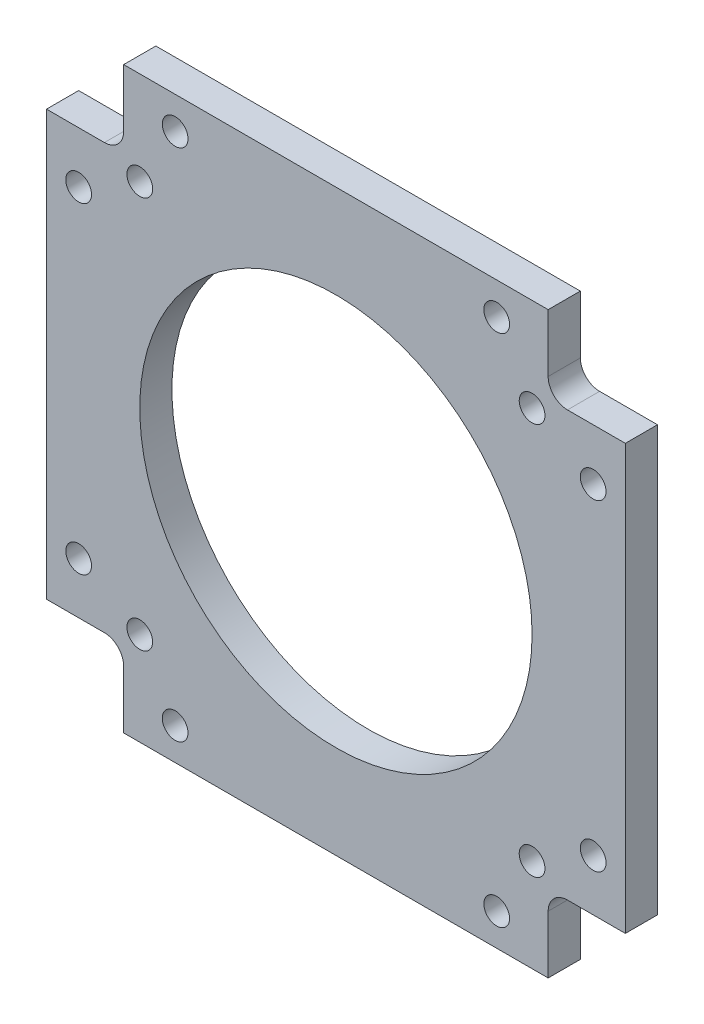
ISO-10303-21;
HEADER;
FILE_DESCRIPTION(('STEP AP214'),'2;1');
FILE_NAME('part.step','',(''),(''),'','','');
FILE_SCHEMA(('AUTOMOTIVE_DESIGN { 1 0 10303 214 1 1 1 1 }'));
ENDSEC;
DATA;
#1=APPLICATION_CONTEXT('core data for automotive mechanical design processes');
#2=APPLICATION_PROTOCOL_DEFINITION('international standard','automotive_design',2000,#1);
#3=PRODUCT_CONTEXT('',#1,'mechanical');
#4=PRODUCT('Part','Part','',(#3));
#5=PRODUCT_RELATED_PRODUCT_CATEGORY('part','',(#4));
#6=PRODUCT_DEFINITION_FORMATION('','',#4);
#7=PRODUCT_DEFINITION_CONTEXT('part definition',#1,'design');
#8=PRODUCT_DEFINITION('design','',#6,#7);
#9=PRODUCT_DEFINITION_SHAPE('','',#8);
#10=(LENGTH_UNIT() NAMED_UNIT(*) SI_UNIT(.MILLI.,.METRE.));
#11=(NAMED_UNIT(*) PLANE_ANGLE_UNIT() SI_UNIT($,.RADIAN.));
#12=(NAMED_UNIT(*) SI_UNIT($,.STERADIAN.) SOLID_ANGLE_UNIT());
#13=UNCERTAINTY_MEASURE_WITH_UNIT(LENGTH_MEASURE(1.E-05),#10,'distance_accuracy_value','');
#14=(GEOMETRIC_REPRESENTATION_CONTEXT(3) GLOBAL_UNCERTAINTY_ASSIGNED_CONTEXT((#13)) GLOBAL_UNIT_ASSIGNED_CONTEXT((#10,
#11,#12)) REPRESENTATION_CONTEXT('',''));
#15=CARTESIAN_POINT('',(0.,0.,0.));
#16=DIRECTION('',(0.,0.,1.));
#17=DIRECTION('',(1.,0.,0.));
#18=AXIS2_PLACEMENT_3D('',#15,#16,#17);
#19=CARTESIAN_POINT('',(0.,0.,5.));
#20=DIRECTION('',(0.,0.,-1.));
#21=DIRECTION('',(-1.,0.,0.));
#22=AXIS2_PLACEMENT_3D('',#19,#20,#21);
#23=PLANE('',#22);
#24=CARTESIAN_POINT('',(-40.,25.,5.));
#25=DIRECTION('',(0.,0.,-1.));
#26=DIRECTION('',(-1.,0.,0.));
#27=AXIS2_PLACEMENT_3D('',#24,#25,#26);
#28=CIRCLE('',#27,2.);
#29=CARTESIAN_POINT('',(-42.,25.,5.));
#30=VERTEX_POINT('',#29);
#31=EDGE_CURVE('E406',#30,#30,#28,.F.);
#32=ORIENTED_EDGE('',*,*,#31,.F.);
#33=EDGE_LOOP('',(#32));
#34=FACE_BOUND('',#33,.T.);
#35=CARTESIAN_POINT('',(-25.,40.,5.));
#36=DIRECTION('',(0.,0.,-1.));
#37=DIRECTION('',(-1.,0.,0.));
#38=AXIS2_PLACEMENT_3D('',#35,#36,#37);
#39=CIRCLE('',#38,2.);
#40=CARTESIAN_POINT('',(-27.,40.,5.));
#41=VERTEX_POINT('',#40);
#42=EDGE_CURVE('E421',#41,#41,#39,.F.);
#43=ORIENTED_EDGE('',*,*,#42,.F.);
#44=EDGE_LOOP('',(#43));
#45=FACE_BOUND('',#44,.T.);
#46=CARTESIAN_POINT('',(-25.,-40.,5.));
#47=DIRECTION('',(0.,0.,-1.));
#48=DIRECTION('',(-1.,0.,0.));
#49=AXIS2_PLACEMENT_3D('',#46,#47,#48);
#50=CIRCLE('',#49,2.);
#51=CARTESIAN_POINT('',(-27.,-40.,5.));
#52=VERTEX_POINT('',#51);
#53=EDGE_CURVE('E415',#52,#52,#50,.F.);
#54=ORIENTED_EDGE('',*,*,#53,.F.);
#55=EDGE_LOOP('',(#54));
#56=FACE_BOUND('',#55,.T.);
#57=CARTESIAN_POINT('',(25.,-40.,5.));
#58=DIRECTION('',(0.,0.,-1.));
#59=DIRECTION('',(-1.,0.,0.));
#60=AXIS2_PLACEMENT_3D('',#57,#58,#59);
#61=CIRCLE('',#60,2.);
#62=CARTESIAN_POINT('',(23.,-40.,5.));
#63=VERTEX_POINT('',#62);
#64=EDGE_CURVE('E407',#63,#63,#61,.F.);
#65=ORIENTED_EDGE('',*,*,#64,.F.);
#66=EDGE_LOOP('',(#65));
#67=FACE_BOUND('',#66,.T.);
#68=CARTESIAN_POINT('',(40.,-25.,5.));
#69=DIRECTION('',(0.,0.,-1.));
#70=DIRECTION('',(-1.,0.,0.));
#71=AXIS2_PLACEMENT_3D('',#68,#69,#70);
#72=CIRCLE('',#71,2.);
#73=CARTESIAN_POINT('',(38.,-25.,5.));
#74=VERTEX_POINT('',#73);
#75=EDGE_CURVE('E438',#74,#74,#72,.F.);
#76=ORIENTED_EDGE('',*,*,#75,.F.);
#77=EDGE_LOOP('',(#76));
#78=FACE_BOUND('',#77,.T.);
#79=CARTESIAN_POINT('',(40.,25.,5.));
#80=DIRECTION('',(0.,0.,-1.));
#81=DIRECTION('',(-1.,0.,0.));
#82=AXIS2_PLACEMENT_3D('',#79,#80,#81);
#83=CIRCLE('',#82,2.);
#84=CARTESIAN_POINT('',(38.,25.,5.));
#85=VERTEX_POINT('',#84);
#86=EDGE_CURVE('E431',#85,#85,#83,.F.);
#87=ORIENTED_EDGE('',*,*,#86,.F.);
#88=EDGE_LOOP('',(#87));
#89=FACE_BOUND('',#88,.T.);
#90=CARTESIAN_POINT('',(-40.,-25.,5.));
#91=DIRECTION('',(0.,0.,-1.));
#92=DIRECTION('',(-1.,0.,0.));
#93=AXIS2_PLACEMENT_3D('',#90,#91,#92);
#94=CIRCLE('',#93,2.);
#95=CARTESIAN_POINT('',(-42.,-25.,5.));
#96=VERTEX_POINT('',#95);
#97=EDGE_CURVE('E414',#96,#96,#94,.F.);
#98=ORIENTED_EDGE('',*,*,#97,.F.);
#99=EDGE_LOOP('',(#98));
#100=FACE_BOUND('',#99,.T.);
#101=CARTESIAN_POINT('',(25.,40.,5.));
#102=DIRECTION('',(0.,0.,-1.));
#103=DIRECTION('',(-1.,0.,0.));
#104=AXIS2_PLACEMENT_3D('',#101,#102,#103);
#105=CIRCLE('',#104,2.);
#106=CARTESIAN_POINT('',(23.,40.,5.));
#107=VERTEX_POINT('',#106);
#108=EDGE_CURVE('E398',#107,#107,#105,.F.);
#109=ORIENTED_EDGE('',*,*,#108,.F.);
#110=EDGE_LOOP('',(#109));
#111=FACE_BOUND('',#110,.T.);
#112=DIRECTION('',(0.,-1.,0.));
#113=VECTOR('',#112,1.);
#114=CARTESIAN_POINT('',(-33.,45.,5.));
#115=LINE('',#114,#113);
#116=CARTESIAN_POINT('',(-33.,45.,5.));
#117=VERTEX_POINT('',#116);
#118=CARTESIAN_POINT('',(-33.,36.,5.));
#119=VERTEX_POINT('',#118);
#120=EDGE_CURVE('E158',#117,#119,#115,.T.);
#121=ORIENTED_EDGE('',*,*,#120,.T.);
#122=CARTESIAN_POINT('',(-36.,36.,5.));
#123=DIRECTION('',(0.,0.,-1.));
#124=DIRECTION('',(-1.,0.,0.));
#125=AXIS2_PLACEMENT_3D('',#122,#123,#124);
#126=CIRCLE('',#125,3.);
#127=CARTESIAN_POINT('',(-36.,33.,5.));
#128=VERTEX_POINT('',#127);
#129=EDGE_CURVE('E154',#119,#128,#126,.T.);
#130=ORIENTED_EDGE('',*,*,#129,.T.);
#131=DIRECTION('',(-1.,0.,0.));
#132=VECTOR('',#131,1.);
#133=CARTESIAN_POINT('',(-33.,33.,5.));
#134=LINE('',#133,#132);
#135=CARTESIAN_POINT('',(-45.,33.,5.));
#136=VERTEX_POINT('',#135);
#137=EDGE_CURVE('E145',#128,#136,#134,.T.);
#138=ORIENTED_EDGE('',*,*,#137,.T.);
#139=DIRECTION('',(0.,-1.,0.));
#140=VECTOR('',#139,1.);
#141=CARTESIAN_POINT('',(-45.,-33.0000000000001,5.));
#142=LINE('',#141,#140);
#143=CARTESIAN_POINT('',(-45.,-33.0000000000001,5.));
#144=VERTEX_POINT('',#143);
#145=EDGE_CURVE('E151',#136,#144,#142,.T.);
#146=ORIENTED_EDGE('',*,*,#145,.T.);
#147=DIRECTION('',(1.,0.,0.));
#148=VECTOR('',#147,1.);
#149=CARTESIAN_POINT('',(-33.,-33.,5.));
#150=LINE('',#149,#148);
#151=CARTESIAN_POINT('',(-36.,-33.,5.));
#152=VERTEX_POINT('',#151);
#153=EDGE_CURVE('E173',#144,#152,#150,.T.);
#154=ORIENTED_EDGE('',*,*,#153,.T.);
#155=CARTESIAN_POINT('',(-36.,-36.,5.));
#156=DIRECTION('',(0.,0.,-1.));
#157=DIRECTION('',(-1.,0.,0.));
#158=AXIS2_PLACEMENT_3D('',#155,#156,#157);
#159=CIRCLE('',#158,3.);
#160=CARTESIAN_POINT('',(-33.,-36.,5.));
#161=VERTEX_POINT('',#160);
#162=EDGE_CURVE('E264',#152,#161,#159,.T.);
#163=ORIENTED_EDGE('',*,*,#162,.T.);
#164=DIRECTION('',(0.,-1.,0.));
#165=VECTOR('',#164,1.);
#166=CARTESIAN_POINT('',(-33.,-45.,5.));
#167=LINE('',#166,#165);
#168=CARTESIAN_POINT('',(-33.,-45.,5.));
#169=VERTEX_POINT('',#168);
#170=EDGE_CURVE('E175',#161,#169,#167,.T.);
#171=ORIENTED_EDGE('',*,*,#170,.T.);
#172=DIRECTION('',(1.,0.,0.));
#173=VECTOR('',#172,1.);
#174=CARTESIAN_POINT('',(33.,-45.,5.));
#175=LINE('',#174,#173);
#176=CARTESIAN_POINT('',(33.,-45.,5.));
#177=VERTEX_POINT('',#176);
#178=EDGE_CURVE('E180',#169,#177,#175,.T.);
#179=ORIENTED_EDGE('',*,*,#178,.T.);
#180=DIRECTION('',(0.,1.,0.));
#181=VECTOR('',#180,1.);
#182=CARTESIAN_POINT('',(33.,-45.,5.));
#183=LINE('',#182,#181);
#184=CARTESIAN_POINT('',(33.,-36.,5.));
#185=VERTEX_POINT('',#184);
#186=EDGE_CURVE('E182',#177,#185,#183,.T.);
#187=ORIENTED_EDGE('',*,*,#186,.T.);
#188=CARTESIAN_POINT('',(36.,-36.,5.));
#189=DIRECTION('',(0.,0.,-1.));
#190=DIRECTION('',(-1.,0.,0.));
#191=AXIS2_PLACEMENT_3D('',#188,#189,#190);
#192=CIRCLE('',#191,3.);
#193=CARTESIAN_POINT('',(36.,-33.,5.));
#194=VERTEX_POINT('',#193);
#195=EDGE_CURVE('E260',#185,#194,#192,.T.);
#196=ORIENTED_EDGE('',*,*,#195,.T.);
#197=DIRECTION('',(1.,0.,0.));
#198=VECTOR('',#197,1.);
#199=CARTESIAN_POINT('',(33.,-33.,5.));
#200=LINE('',#199,#198);
#201=CARTESIAN_POINT('',(45.,-33.,5.));
#202=VERTEX_POINT('',#201);
#203=EDGE_CURVE('E185',#194,#202,#200,.T.);
#204=ORIENTED_EDGE('',*,*,#203,.T.);
#205=DIRECTION('',(0.,1.,0.));
#206=VECTOR('',#205,1.);
#207=CARTESIAN_POINT('',(45.,-33.,5.));
#208=LINE('',#207,#206);
#209=CARTESIAN_POINT('',(45.,33.,5.));
#210=VERTEX_POINT('',#209);
#211=EDGE_CURVE('E187',#202,#210,#208,.T.);
#212=ORIENTED_EDGE('',*,*,#211,.T.);
#213=DIRECTION('',(-1.,0.,0.));
#214=VECTOR('',#213,1.);
#215=CARTESIAN_POINT('',(33.,33.,5.));
#216=LINE('',#215,#214);
#217=CARTESIAN_POINT('',(36.,33.,5.));
#218=VERTEX_POINT('',#217);
#219=EDGE_CURVE('E189',#210,#218,#216,.T.);
#220=ORIENTED_EDGE('',*,*,#219,.T.);
#221=CARTESIAN_POINT('',(36.,36.,5.));
#222=DIRECTION('',(0.,0.,-1.));
#223=DIRECTION('',(-1.,0.,0.));
#224=AXIS2_PLACEMENT_3D('',#221,#222,#223);
#225=CIRCLE('',#224,3.);
#226=CARTESIAN_POINT('',(33.,36.,5.));
#227=VERTEX_POINT('',#226);
#228=EDGE_CURVE('E11',#218,#227,#225,.T.);
#229=ORIENTED_EDGE('',*,*,#228,.T.);
#230=DIRECTION('',(0.,1.,0.));
#231=VECTOR('',#230,1.);
#232=CARTESIAN_POINT('',(33.,45.,5.));
#233=LINE('',#232,#231);
#234=CARTESIAN_POINT('',(33.,45.,5.));
#235=VERTEX_POINT('',#234);
#236=EDGE_CURVE('E191',#227,#235,#233,.T.);
#237=ORIENTED_EDGE('',*,*,#236,.T.);
#238=DIRECTION('',(-1.,0.,0.));
#239=VECTOR('',#238,1.);
#240=CARTESIAN_POINT('',(33.,45.,5.));
#241=LINE('',#240,#239);
#242=EDGE_CURVE('E193',#235,#117,#241,.T.);
#243=ORIENTED_EDGE('',*,*,#242,.T.);
#244=EDGE_LOOP('',(#121,#130,#138,#146,#154,#163,#171,#179,#187,#196,#204,#212,#220,#229,#237,#243));
#245=FACE_BOUND('',#244,.T.);
#246=CARTESIAN_POINT('',(0.,0.,5.));
#247=DIRECTION('',(0.,0.,1.));
#248=DIRECTION('',(1.,0.,0.));
#249=AXIS2_PLACEMENT_3D('',#246,#247,#248);
#250=CIRCLE('',#249,30.5);
#251=CARTESIAN_POINT('',(30.5,0.,5.));
#252=VERTEX_POINT('',#251);
#253=EDGE_CURVE('E199',#252,#252,#250,.T.);
#254=ORIENTED_EDGE('',*,*,#253,.F.);
#255=EDGE_LOOP('',(#254));
#256=FACE_BOUND('',#255,.T.);
#257=CARTESIAN_POINT('',(-30.5,30.5,5.));
#258=DIRECTION('',(0.,0.,1.));
#259=DIRECTION('',(1.,0.,0.));
#260=AXIS2_PLACEMENT_3D('',#257,#258,#259);
#261=CIRCLE('',#260,2.);
#262=CARTESIAN_POINT('',(-28.5,30.5,5.));
#263=VERTEX_POINT('',#262);
#264=EDGE_CURVE('E374',#263,#263,#261,.T.);
#265=ORIENTED_EDGE('',*,*,#264,.F.);
#266=EDGE_LOOP('',(#265));
#267=FACE_BOUND('',#266,.T.);
#268=CARTESIAN_POINT('',(30.5,30.5,5.));
#269=DIRECTION('',(0.,0.,1.));
#270=DIRECTION('',(-1.,0.,0.));
#271=AXIS2_PLACEMENT_3D('',#268,#269,#270);
#272=CIRCLE('',#271,2.);
#273=CARTESIAN_POINT('',(28.5,30.5,5.));
#274=VERTEX_POINT('',#273);
#275=EDGE_CURVE('E380',#274,#274,#272,.T.);
#276=ORIENTED_EDGE('',*,*,#275,.F.);
#277=EDGE_LOOP('',(#276));
#278=FACE_BOUND('',#277,.T.);
#279=CARTESIAN_POINT('',(30.5,-30.5,5.));
#280=DIRECTION('',(0.,0.,1.));
#281=DIRECTION('',(1.,0.,0.));
#282=AXIS2_PLACEMENT_3D('',#279,#280,#281);
#283=CIRCLE('',#282,2.);
#284=CARTESIAN_POINT('',(32.5,-30.5,5.));
#285=VERTEX_POINT('',#284);
#286=EDGE_CURVE('E386',#285,#285,#283,.T.);
#287=ORIENTED_EDGE('',*,*,#286,.F.);
#288=EDGE_LOOP('',(#287));
#289=FACE_BOUND('',#288,.T.);
#290=CARTESIAN_POINT('',(-30.5,-30.5,5.));
#291=DIRECTION('',(0.,0.,1.));
#292=DIRECTION('',(-1.,0.,0.));
#293=AXIS2_PLACEMENT_3D('',#290,#291,#292);
#294=CIRCLE('',#293,2.);
#295=CARTESIAN_POINT('',(-32.5,-30.5,5.));
#296=VERTEX_POINT('',#295);
#297=EDGE_CURVE('E392',#296,#296,#294,.T.);
#298=ORIENTED_EDGE('',*,*,#297,.F.);
#299=EDGE_LOOP('',(#298));
#300=FACE_BOUND('',#299,.T.);
#301=ADVANCED_FACE('F33',(#34,#45,#56,#67,#78,#89,#100,#111,#245,#256,#267,#278,#289,#300),#23,.F.);
#302=CARTESIAN_POINT('',(0.,0.,0.));
#303=DIRECTION('',(0.,0.,-1.));
#304=DIRECTION('',(-1.,0.,0.));
#305=AXIS2_PLACEMENT_3D('',#302,#303,#304);
#306=PLANE('',#305);
#307=CARTESIAN_POINT('',(-40.,25.,0.));
#308=DIRECTION('',(0.,0.,-1.));
#309=DIRECTION('',(-1.,0.,0.));
#310=AXIS2_PLACEMENT_3D('',#307,#308,#309);
#311=CIRCLE('',#310,2.);
#312=CARTESIAN_POINT('',(-42.,25.,0.));
#313=VERTEX_POINT('',#312);
#314=EDGE_CURVE('E424',#313,#313,#311,.T.);
#315=ORIENTED_EDGE('',*,*,#314,.F.);
#316=EDGE_LOOP('',(#315));
#317=FACE_BOUND('',#316,.T.);
#318=CARTESIAN_POINT('',(-25.,40.,0.));
#319=DIRECTION('',(0.,0.,-1.));
#320=DIRECTION('',(1.,0.,0.));
#321=AXIS2_PLACEMENT_3D('',#318,#319,#320);
#322=CIRCLE('',#321,2.);
#323=CARTESIAN_POINT('',(-23.,40.,0.));
#324=VERTEX_POINT('',#323);
#325=EDGE_CURVE('E418',#324,#324,#322,.T.);
#326=ORIENTED_EDGE('',*,*,#325,.F.);
#327=EDGE_LOOP('',(#326));
#328=FACE_BOUND('',#327,.T.);
#329=CARTESIAN_POINT('',(-25.,-40.,0.));
#330=DIRECTION('',(0.,0.,-1.));
#331=DIRECTION('',(-1.,0.,0.));
#332=AXIS2_PLACEMENT_3D('',#329,#330,#331);
#333=CIRCLE('',#332,2.);
#334=CARTESIAN_POINT('',(-27.,-40.,0.));
#335=VERTEX_POINT('',#334);
#336=EDGE_CURVE('E410',#335,#335,#333,.T.);
#337=ORIENTED_EDGE('',*,*,#336,.F.);
#338=EDGE_LOOP('',(#337));
#339=FACE_BOUND('',#338,.T.);
#340=CARTESIAN_POINT('',(25.,-40.,0.));
#341=DIRECTION('',(0.,0.,-1.));
#342=DIRECTION('',(1.,0.,0.));
#343=AXIS2_PLACEMENT_3D('',#340,#341,#342);
#344=CIRCLE('',#343,2.);
#345=CARTESIAN_POINT('',(27.,-40.,0.));
#346=VERTEX_POINT('',#345);
#347=EDGE_CURVE('E411',#346,#346,#344,.T.);
#348=ORIENTED_EDGE('',*,*,#347,.F.);
#349=EDGE_LOOP('',(#348));
#350=FACE_BOUND('',#349,.T.);
#351=CARTESIAN_POINT('',(40.,-25.,0.));
#352=DIRECTION('',(0.,0.,-1.));
#353=DIRECTION('',(-1.,0.,0.));
#354=AXIS2_PLACEMENT_3D('',#351,#352,#353);
#355=CIRCLE('',#354,2.);
#356=CARTESIAN_POINT('',(38.,-25.,0.));
#357=VERTEX_POINT('',#356);
#358=EDGE_CURVE('E445',#357,#357,#355,.T.);
#359=ORIENTED_EDGE('',*,*,#358,.F.);
#360=EDGE_LOOP('',(#359));
#361=FACE_BOUND('',#360,.T.);
#362=CARTESIAN_POINT('',(40.,25.,0.));
#363=DIRECTION('',(0.,0.,-1.));
#364=DIRECTION('',(1.,0.,0.));
#365=AXIS2_PLACEMENT_3D('',#362,#363,#364);
#366=CIRCLE('',#365,2.);
#367=CARTESIAN_POINT('',(42.,25.,0.));
#368=VERTEX_POINT('',#367);
#369=EDGE_CURVE('E435',#368,#368,#366,.T.);
#370=ORIENTED_EDGE('',*,*,#369,.F.);
#371=EDGE_LOOP('',(#370));
#372=FACE_BOUND('',#371,.T.);
#373=CARTESIAN_POINT('',(-40.,-25.,0.));
#374=DIRECTION('',(0.,0.,-1.));
#375=DIRECTION('',(1.,0.,0.));
#376=AXIS2_PLACEMENT_3D('',#373,#374,#375);
#377=CIRCLE('',#376,2.);
#378=CARTESIAN_POINT('',(-38.,-25.,0.));
#379=VERTEX_POINT('',#378);
#380=EDGE_CURVE('E434',#379,#379,#377,.T.);
#381=ORIENTED_EDGE('',*,*,#380,.F.);
#382=EDGE_LOOP('',(#381));
#383=FACE_BOUND('',#382,.T.);
#384=CARTESIAN_POINT('',(25.,40.,0.));
#385=DIRECTION('',(0.,0.,-1.));
#386=DIRECTION('',(-1.,0.,0.));
#387=AXIS2_PLACEMENT_3D('',#384,#385,#386);
#388=CIRCLE('',#387,2.);
#389=CARTESIAN_POINT('',(23.,40.,0.));
#390=VERTEX_POINT('',#389);
#391=EDGE_CURVE('E403',#390,#390,#388,.T.);
#392=ORIENTED_EDGE('',*,*,#391,.F.);
#393=EDGE_LOOP('',(#392));
#394=FACE_BOUND('',#393,.T.);
#395=CARTESIAN_POINT('',(30.5,-30.5,0.));
#396=DIRECTION('',(0.,0.,1.));
#397=DIRECTION('',(1.,0.,0.));
#398=AXIS2_PLACEMENT_3D('',#395,#396,#397);
#399=CIRCLE('',#398,2.);
#400=CARTESIAN_POINT('',(32.5,-30.5,0.));
#401=VERTEX_POINT('',#400);
#402=EDGE_CURVE('E389',#401,#401,#399,.T.);
#403=ORIENTED_EDGE('',*,*,#402,.T.);
#404=EDGE_LOOP('',(#403));
#405=FACE_BOUND('',#404,.T.);
#406=CARTESIAN_POINT('',(-30.5,30.5,0.));
#407=DIRECTION('',(0.,0.,1.));
#408=DIRECTION('',(1.,0.,0.));
#409=AXIS2_PLACEMENT_3D('',#406,#407,#408);
#410=CIRCLE('',#409,2.);
#411=CARTESIAN_POINT('',(-28.5,30.5,0.));
#412=VERTEX_POINT('',#411);
#413=EDGE_CURVE('E377',#412,#412,#410,.T.);
#414=ORIENTED_EDGE('',*,*,#413,.T.);
#415=EDGE_LOOP('',(#414));
#416=FACE_BOUND('',#415,.T.);
#417=DIRECTION('',(0.,-1.,0.));
#418=VECTOR('',#417,1.);
#419=CARTESIAN_POINT('',(-33.,45.,0.));
#420=LINE('',#419,#418);
#421=CARTESIAN_POINT('',(-33.,45.,0.));
#422=VERTEX_POINT('',#421);
#423=CARTESIAN_POINT('',(-33.,36.,0.));
#424=VERTEX_POINT('',#423);
#425=EDGE_CURVE('E196',#422,#424,#420,.T.);
#426=ORIENTED_EDGE('',*,*,#425,.F.);
#427=DIRECTION('',(-1.,0.,0.));
#428=VECTOR('',#427,1.);
#429=CARTESIAN_POINT('',(33.,45.,0.));
#430=LINE('',#429,#428);
#431=CARTESIAN_POINT('',(33.,45.,0.));
#432=VERTEX_POINT('',#431);
#433=EDGE_CURVE('E221',#432,#422,#430,.T.);
#434=ORIENTED_EDGE('',*,*,#433,.F.);
#435=DIRECTION('',(0.,1.,0.));
#436=VECTOR('',#435,1.);
#437=CARTESIAN_POINT('',(33.,45.,0.));
#438=LINE('',#437,#436);
#439=CARTESIAN_POINT('',(33.,36.,0.));
#440=VERTEX_POINT('',#439);
#441=EDGE_CURVE('E219',#440,#432,#438,.T.);
#442=ORIENTED_EDGE('',*,*,#441,.F.);
#443=CARTESIAN_POINT('',(36.,36.,0.));
#444=DIRECTION('',(0.,0.,-1.));
#445=DIRECTION('',(-1.,0.,0.));
#446=AXIS2_PLACEMENT_3D('',#443,#444,#445);
#447=CIRCLE('',#446,3.);
#448=CARTESIAN_POINT('',(36.,33.,0.));
#449=VERTEX_POINT('',#448);
#450=EDGE_CURVE('E41',#440,#449,#447,.F.);
#451=ORIENTED_EDGE('',*,*,#450,.T.);
#452=DIRECTION('',(-1.,0.,0.));
#453=VECTOR('',#452,1.);
#454=CARTESIAN_POINT('',(33.,33.,0.));
#455=LINE('',#454,#453);
#456=CARTESIAN_POINT('',(45.,33.,0.));
#457=VERTEX_POINT('',#456);
#458=EDGE_CURVE('E217',#457,#449,#455,.T.);
#459=ORIENTED_EDGE('',*,*,#458,.F.);
#460=DIRECTION('',(0.,1.,0.));
#461=VECTOR('',#460,1.);
#462=CARTESIAN_POINT('',(45.,-33.,0.));
#463=LINE('',#462,#461);
#464=CARTESIAN_POINT('',(45.,-33.,0.));
#465=VERTEX_POINT('',#464);
#466=EDGE_CURVE('E215',#465,#457,#463,.T.);
#467=ORIENTED_EDGE('',*,*,#466,.F.);
#468=DIRECTION('',(1.,0.,0.));
#469=VECTOR('',#468,1.);
#470=CARTESIAN_POINT('',(33.,-33.,0.));
#471=LINE('',#470,#469);
#472=CARTESIAN_POINT('',(36.,-33.,0.));
#473=VERTEX_POINT('',#472);
#474=EDGE_CURVE('E213',#473,#465,#471,.T.);
#475=ORIENTED_EDGE('',*,*,#474,.F.);
#476=CARTESIAN_POINT('',(36.,-36.,0.));
#477=DIRECTION('',(0.,0.,-1.));
#478=DIRECTION('',(-1.,0.,0.));
#479=AXIS2_PLACEMENT_3D('',#476,#477,#478);
#480=CIRCLE('',#479,3.);
#481=CARTESIAN_POINT('',(33.,-36.,0.));
#482=VERTEX_POINT('',#481);
#483=EDGE_CURVE('E258',#473,#482,#480,.F.);
#484=ORIENTED_EDGE('',*,*,#483,.T.);
#485=DIRECTION('',(0.,1.,0.));
#486=VECTOR('',#485,1.);
#487=CARTESIAN_POINT('',(33.,-45.,0.));
#488=LINE('',#487,#486);
#489=CARTESIAN_POINT('',(33.,-45.,0.));
#490=VERTEX_POINT('',#489);
#491=EDGE_CURVE('E210',#490,#482,#488,.T.);
#492=ORIENTED_EDGE('',*,*,#491,.F.);
#493=DIRECTION('',(1.,0.,0.));
#494=VECTOR('',#493,1.);
#495=CARTESIAN_POINT('',(33.,-45.,0.));
#496=LINE('',#495,#494);
#497=CARTESIAN_POINT('',(-33.,-45.,0.));
#498=VERTEX_POINT('',#497);
#499=EDGE_CURVE('E208',#498,#490,#496,.T.);
#500=ORIENTED_EDGE('',*,*,#499,.F.);
#501=DIRECTION('',(0.,-1.,0.));
#502=VECTOR('',#501,1.);
#503=CARTESIAN_POINT('',(-33.,-45.,0.));
#504=LINE('',#503,#502);
#505=CARTESIAN_POINT('',(-33.,-36.,0.));
#506=VERTEX_POINT('',#505);
#507=EDGE_CURVE('E206',#506,#498,#504,.T.);
#508=ORIENTED_EDGE('',*,*,#507,.F.);
#509=CARTESIAN_POINT('',(-36.,-36.,0.));
#510=DIRECTION('',(0.,0.,-1.));
#511=DIRECTION('',(-1.,0.,0.));
#512=AXIS2_PLACEMENT_3D('',#509,#510,#511);
#513=CIRCLE('',#512,3.);
#514=CARTESIAN_POINT('',(-36.,-33.,0.));
#515=VERTEX_POINT('',#514);
#516=EDGE_CURVE('E262',#506,#515,#513,.F.);
#517=ORIENTED_EDGE('',*,*,#516,.T.);
#518=DIRECTION('',(1.,0.,0.));
#519=VECTOR('',#518,1.);
#520=CARTESIAN_POINT('',(-33.,-33.,0.));
#521=LINE('',#520,#519);
#522=CARTESIAN_POINT('',(-45.,-33.0000000000001,0.));
#523=VERTEX_POINT('',#522);
#524=EDGE_CURVE('E203',#523,#515,#521,.T.);
#525=ORIENTED_EDGE('',*,*,#524,.F.);
#526=DIRECTION('',(0.,-1.,0.));
#527=VECTOR('',#526,1.);
#528=CARTESIAN_POINT('',(-45.,-33.0000000000001,0.));
#529=LINE('',#528,#527);
#530=CARTESIAN_POINT('',(-45.,33.,0.));
#531=VERTEX_POINT('',#530);
#532=EDGE_CURVE('E201',#531,#523,#529,.T.);
#533=ORIENTED_EDGE('',*,*,#532,.F.);
#534=DIRECTION('',(-1.,0.,0.));
#535=VECTOR('',#534,1.);
#536=CARTESIAN_POINT('',(-33.,33.,0.));
#537=LINE('',#536,#535);
#538=CARTESIAN_POINT('',(-36.,33.,0.));
#539=VERTEX_POINT('',#538);
#540=EDGE_CURVE('E164',#539,#531,#537,.T.);
#541=ORIENTED_EDGE('',*,*,#540,.F.);
#542=CARTESIAN_POINT('',(-36.,36.,0.));
#543=DIRECTION('',(0.,0.,-1.));
#544=DIRECTION('',(-1.,0.,0.));
#545=AXIS2_PLACEMENT_3D('',#542,#543,#544);
#546=CIRCLE('',#545,3.);
#547=EDGE_CURVE('E266',#539,#424,#546,.F.);
#548=ORIENTED_EDGE('',*,*,#547,.T.);
#549=EDGE_LOOP('',(#426,#434,#442,#451,#459,#467,#475,#484,#492,#500,#508,#517,#525,#533,#541,#548));
#550=FACE_BOUND('',#549,.T.);
#551=CARTESIAN_POINT('',(0.,0.,0.));
#552=DIRECTION('',(0.,0.,1.));
#553=DIRECTION('',(1.,0.,0.));
#554=AXIS2_PLACEMENT_3D('',#551,#552,#553);
#555=CIRCLE('',#554,30.5);
#556=CARTESIAN_POINT('',(30.5,0.,0.));
#557=VERTEX_POINT('',#556);
#558=EDGE_CURVE('E371',#557,#557,#555,.T.);
#559=ORIENTED_EDGE('',*,*,#558,.T.);
#560=EDGE_LOOP('',(#559));
#561=FACE_BOUND('',#560,.T.);
#562=CARTESIAN_POINT('',(30.5,30.5,0.));
#563=DIRECTION('',(0.,0.,1.));
#564=DIRECTION('',(-1.,0.,0.));
#565=AXIS2_PLACEMENT_3D('',#562,#563,#564);
#566=CIRCLE('',#565,2.);
#567=CARTESIAN_POINT('',(28.5,30.5,0.));
#568=VERTEX_POINT('',#567);
#569=EDGE_CURVE('E383',#568,#568,#566,.T.);
#570=ORIENTED_EDGE('',*,*,#569,.T.);
#571=EDGE_LOOP('',(#570));
#572=FACE_BOUND('',#571,.T.);
#573=CARTESIAN_POINT('',(-30.5,-30.5,0.));
#574=DIRECTION('',(0.,0.,1.));
#575=DIRECTION('',(-1.,0.,0.));
#576=AXIS2_PLACEMENT_3D('',#573,#574,#575);
#577=CIRCLE('',#576,2.);
#578=CARTESIAN_POINT('',(-32.5,-30.5,0.));
#579=VERTEX_POINT('',#578);
#580=EDGE_CURVE('E395',#579,#579,#577,.T.);
#581=ORIENTED_EDGE('',*,*,#580,.T.);
#582=EDGE_LOOP('',(#581));
#583=FACE_BOUND('',#582,.T.);
#584=ADVANCED_FACE('F269',(#317,#328,#339,#350,#361,#372,#383,#394,#405,#416,#550,#561,#572,
#583),#306,.T.);
#585=CARTESIAN_POINT('',(-33.,45.,5.));
#586=DIRECTION('',(1.,0.,0.));
#587=DIRECTION('',(0.,1.,0.));
#588=AXIS2_PLACEMENT_3D('',#585,#586,#587);
#589=PLANE('',#588);
#590=ORIENTED_EDGE('',*,*,#425,.T.);
#591=DIRECTION('',(0.,0.,-1.));
#592=VECTOR('',#591,1.);
#593=CARTESIAN_POINT('',(-33.,36.,5.));
#594=LINE('',#593,#592);
#595=EDGE_CURVE('E252',#424,#119,#594,.F.);
#596=ORIENTED_EDGE('',*,*,#595,.T.);
#597=ORIENTED_EDGE('',*,*,#120,.F.);
#598=DIRECTION('',(0.,0.,-1.));
#599=VECTOR('',#598,1.);
#600=CARTESIAN_POINT('',(-33.,45.,5.));
#601=LINE('',#600,#599);
#602=EDGE_CURVE('E195',#117,#422,#601,.T.);
#603=ORIENTED_EDGE('',*,*,#602,.T.);
#604=EDGE_LOOP('',(#590,#596,#597,#603));
#605=FACE_BOUND('',#604,.T.);
#606=ADVANCED_FACE('F275',(#605),#589,.F.);
#607=CARTESIAN_POINT('',(-33.,33.,5.));
#608=DIRECTION('',(0.,-1.,0.));
#609=DIRECTION('',(0.,0.,-1.));
#610=AXIS2_PLACEMENT_3D('',#607,#608,#609);
#611=PLANE('',#610);
#612=ORIENTED_EDGE('',*,*,#137,.F.);
#613=DIRECTION('',(0.,0.,-1.));
#614=VECTOR('',#613,1.);
#615=CARTESIAN_POINT('',(-36.,33.,0.));
#616=LINE('',#615,#614);
#617=EDGE_CURVE('E250',#128,#539,#616,.T.);
#618=ORIENTED_EDGE('',*,*,#617,.T.);
#619=ORIENTED_EDGE('',*,*,#540,.T.);
#620=DIRECTION('',(0.,0.,-1.));
#621=VECTOR('',#620,1.);
#622=CARTESIAN_POINT('',(-45.,33.,5.));
#623=LINE('',#622,#621);
#624=EDGE_CURVE('E161',#136,#531,#623,.T.);
#625=ORIENTED_EDGE('',*,*,#624,.F.);
#626=EDGE_LOOP('',(#612,#618,#619,#625));
#627=FACE_BOUND('',#626,.T.);
#628=ADVANCED_FACE('F162',(#627),#611,.F.);
#629=CARTESIAN_POINT('',(-45.,-33.0000000000001,5.));
#630=DIRECTION('',(1.,0.,0.));
#631=DIRECTION('',(0.,1.,0.));
#632=AXIS2_PLACEMENT_3D('',#629,#630,#631);
#633=PLANE('',#632);
#634=ORIENTED_EDGE('',*,*,#532,.T.);
#635=DIRECTION('',(0.,0.,-1.));
#636=VECTOR('',#635,1.);
#637=CARTESIAN_POINT('',(-45.,-33.0000000000001,5.));
#638=LINE('',#637,#636);
#639=EDGE_CURVE('E168',#144,#523,#638,.T.);
#640=ORIENTED_EDGE('',*,*,#639,.F.);
#641=ORIENTED_EDGE('',*,*,#145,.F.);
#642=ORIENTED_EDGE('',*,*,#624,.T.);
#643=EDGE_LOOP('',(#634,#640,#641,#642));
#644=FACE_BOUND('',#643,.T.);
#645=ADVANCED_FACE('F170',(#644),#633,.F.);
#646=CARTESIAN_POINT('',(-33.,-33.,5.));
#647=DIRECTION('',(0.,1.,0.));
#648=DIRECTION('',(-1.,0.,0.));
#649=AXIS2_PLACEMENT_3D('',#646,#647,#648);
#650=PLANE('',#649);
#651=ORIENTED_EDGE('',*,*,#524,.T.);
#652=DIRECTION('',(0.,0.,-1.));
#653=VECTOR('',#652,1.);
#654=CARTESIAN_POINT('',(-36.,-33.,5.));
#655=LINE('',#654,#653);
#656=EDGE_CURVE('E248',#515,#152,#655,.F.);
#657=ORIENTED_EDGE('',*,*,#656,.T.);
#658=ORIENTED_EDGE('',*,*,#153,.F.);
#659=ORIENTED_EDGE('',*,*,#639,.T.);
#660=EDGE_LOOP('',(#651,#657,#658,#659));
#661=FACE_BOUND('',#660,.T.);
#662=ADVANCED_FACE('F335',(#661),#650,.F.);
#663=CARTESIAN_POINT('',(-33.,-45.,5.));
#664=DIRECTION('',(1.,0.,0.));
#665=DIRECTION('',(0.,1.,0.));
#666=AXIS2_PLACEMENT_3D('',#663,#664,#665);
#667=PLANE('',#666);
#668=ORIENTED_EDGE('',*,*,#170,.F.);
#669=DIRECTION('',(0.,0.,-1.));
#670=VECTOR('',#669,1.);
#671=CARTESIAN_POINT('',(-33.,-36.,0.));
#672=LINE('',#671,#670);
#673=EDGE_CURVE('E245',#161,#506,#672,.T.);
#674=ORIENTED_EDGE('',*,*,#673,.T.);
#675=ORIENTED_EDGE('',*,*,#507,.T.);
#676=DIRECTION('',(0.,0.,-1.));
#677=VECTOR('',#676,1.);
#678=CARTESIAN_POINT('',(-33.,-45.,5.));
#679=LINE('',#678,#677);
#680=EDGE_CURVE('E237',#169,#498,#679,.T.);
#681=ORIENTED_EDGE('',*,*,#680,.F.);
#682=EDGE_LOOP('',(#668,#674,#675,#681));
#683=FACE_BOUND('',#682,.T.);
#684=ADVANCED_FACE('F331',(#683),#667,.F.);
#685=CARTESIAN_POINT('',(33.,-45.,5.));
#686=DIRECTION('',(0.,1.,0.));
#687=DIRECTION('',(-1.,0.,0.));
#688=AXIS2_PLACEMENT_3D('',#685,#686,#687);
#689=PLANE('',#688);
#690=ORIENTED_EDGE('',*,*,#499,.T.);
#691=DIRECTION('',(0.,0.,-1.));
#692=VECTOR('',#691,1.);
#693=CARTESIAN_POINT('',(33.,-45.,5.));
#694=LINE('',#693,#692);
#695=EDGE_CURVE('E234',#177,#490,#694,.T.);
#696=ORIENTED_EDGE('',*,*,#695,.F.);
#697=ORIENTED_EDGE('',*,*,#178,.F.);
#698=ORIENTED_EDGE('',*,*,#680,.T.);
#699=EDGE_LOOP('',(#690,#696,#697,#698));
#700=FACE_BOUND('',#699,.T.);
#701=ADVANCED_FACE('F327',(#700),#689,.F.);
#702=CARTESIAN_POINT('',(33.,-45.,5.));
#703=DIRECTION('',(-1.,0.,0.));
#704=DIRECTION('',(0.,-1.,0.));
#705=AXIS2_PLACEMENT_3D('',#702,#703,#704);
#706=PLANE('',#705);
#707=ORIENTED_EDGE('',*,*,#491,.T.);
#708=DIRECTION('',(0.,0.,-1.));
#709=VECTOR('',#708,1.);
#710=CARTESIAN_POINT('',(33.,-36.,5.));
#711=LINE('',#710,#709);
#712=EDGE_CURVE('E243',#482,#185,#711,.F.);
#713=ORIENTED_EDGE('',*,*,#712,.T.);
#714=ORIENTED_EDGE('',*,*,#186,.F.);
#715=ORIENTED_EDGE('',*,*,#695,.T.);
#716=EDGE_LOOP('',(#707,#713,#714,#715));
#717=FACE_BOUND('',#716,.T.);
#718=ADVANCED_FACE('F323',(#717),#706,.F.);
#719=CARTESIAN_POINT('',(33.,-33.,5.));
#720=DIRECTION('',(0.,1.,0.));
#721=DIRECTION('',(-1.,0.,0.));
#722=AXIS2_PLACEMENT_3D('',#719,#720,#721);
#723=PLANE('',#722);
#724=ORIENTED_EDGE('',*,*,#203,.F.);
#725=DIRECTION('',(0.,0.,-1.));
#726=VECTOR('',#725,1.);
#727=CARTESIAN_POINT('',(36.,-33.,0.));
#728=LINE('',#727,#726);
#729=EDGE_CURVE('E167',#194,#473,#728,.T.);
#730=ORIENTED_EDGE('',*,*,#729,.T.);
#731=ORIENTED_EDGE('',*,*,#474,.T.);
#732=DIRECTION('',(0.,0.,-1.));
#733=VECTOR('',#732,1.);
#734=CARTESIAN_POINT('',(45.,-33.,5.));
#735=LINE('',#734,#733);
#736=EDGE_CURVE('E231',#202,#465,#735,.T.);
#737=ORIENTED_EDGE('',*,*,#736,.F.);
#738=EDGE_LOOP('',(#724,#730,#731,#737));
#739=FACE_BOUND('',#738,.T.);
#740=ADVANCED_FACE('F319',(#739),#723,.F.);
#741=CARTESIAN_POINT('',(45.,-33.,5.));
#742=DIRECTION('',(-1.,0.,0.));
#743=DIRECTION('',(0.,-1.,0.));
#744=AXIS2_PLACEMENT_3D('',#741,#742,#743);
#745=PLANE('',#744);
#746=ORIENTED_EDGE('',*,*,#466,.T.);
#747=DIRECTION('',(0.,0.,-1.));
#748=VECTOR('',#747,1.);
#749=CARTESIAN_POINT('',(45.,33.,5.));
#750=LINE('',#749,#748);
#751=EDGE_CURVE('E228',#210,#457,#750,.T.);
#752=ORIENTED_EDGE('',*,*,#751,.F.);
#753=ORIENTED_EDGE('',*,*,#211,.F.);
#754=ORIENTED_EDGE('',*,*,#736,.T.);
#755=EDGE_LOOP('',(#746,#752,#753,#754));
#756=FACE_BOUND('',#755,.T.);
#757=ADVANCED_FACE('F316',(#756),#745,.F.);
#758=CARTESIAN_POINT('',(33.,33.,5.));
#759=DIRECTION('',(0.,-1.,0.));
#760=DIRECTION('',(0.,0.,-1.));
#761=AXIS2_PLACEMENT_3D('',#758,#759,#760);
#762=PLANE('',#761);
#763=ORIENTED_EDGE('',*,*,#458,.T.);
#764=DIRECTION('',(0.,0.,-1.));
#765=VECTOR('',#764,1.);
#766=CARTESIAN_POINT('',(36.,33.,5.));
#767=LINE('',#766,#765);
#768=EDGE_CURVE('E48',#449,#218,#767,.F.);
#769=ORIENTED_EDGE('',*,*,#768,.T.);
#770=ORIENTED_EDGE('',*,*,#219,.F.);
#771=ORIENTED_EDGE('',*,*,#751,.T.);
#772=EDGE_LOOP('',(#763,#769,#770,#771));
#773=FACE_BOUND('',#772,.T.);
#774=ADVANCED_FACE('F312',(#773),#762,.F.);
#775=CARTESIAN_POINT('',(33.,45.,5.));
#776=DIRECTION('',(-1.,0.,0.));
#777=DIRECTION('',(0.,-1.,0.));
#778=AXIS2_PLACEMENT_3D('',#775,#776,#777);
#779=PLANE('',#778);
#780=ORIENTED_EDGE('',*,*,#236,.F.);
#781=DIRECTION('',(0.,0.,-1.));
#782=VECTOR('',#781,1.);
#783=CARTESIAN_POINT('',(33.,36.,0.));
#784=LINE('',#783,#782);
#785=EDGE_CURVE('E254',#227,#440,#784,.T.);
#786=ORIENTED_EDGE('',*,*,#785,.T.);
#787=ORIENTED_EDGE('',*,*,#441,.T.);
#788=DIRECTION('',(0.,0.,-1.));
#789=VECTOR('',#788,1.);
#790=CARTESIAN_POINT('',(33.,45.,5.));
#791=LINE('',#790,#789);
#792=EDGE_CURVE('E225',#235,#432,#791,.T.);
#793=ORIENTED_EDGE('',*,*,#792,.F.);
#794=EDGE_LOOP('',(#780,#786,#787,#793));
#795=FACE_BOUND('',#794,.T.);
#796=ADVANCED_FACE('F308',(#795),#779,.F.);
#797=CARTESIAN_POINT('',(33.,45.,5.));
#798=DIRECTION('',(0.,-1.,0.));
#799=DIRECTION('',(1.,0.,0.));
#800=AXIS2_PLACEMENT_3D('',#797,#798,#799);
#801=PLANE('',#800);
#802=ORIENTED_EDGE('',*,*,#433,.T.);
#803=ORIENTED_EDGE('',*,*,#602,.F.);
#804=ORIENTED_EDGE('',*,*,#242,.F.);
#805=ORIENTED_EDGE('',*,*,#792,.T.);
#806=EDGE_LOOP('',(#802,#803,#804,#805));
#807=FACE_BOUND('',#806,.T.);
#808=ADVANCED_FACE('F305',(#807),#801,.F.);
#809=CARTESIAN_POINT('',(0.,0.,5.));
#810=DIRECTION('',(0.,0.,-1.));
#811=DIRECTION('',(-1.,0.,0.));
#812=AXIS2_PLACEMENT_3D('',#809,#810,#811);
#813=CYLINDRICAL_SURFACE('',#812,30.5);
#814=ORIENTED_EDGE('',*,*,#253,.T.);
#815=EDGE_LOOP('',(#814));
#816=FACE_BOUND('',#815,.T.);
#817=ORIENTED_EDGE('',*,*,#558,.F.);
#818=EDGE_LOOP('',(#817));
#819=FACE_BOUND('',#818,.T.);
#820=ADVANCED_FACE('F302',(#816,#819),#813,.F.);
#821=CARTESIAN_POINT('',(-30.5,30.5,5.));
#822=DIRECTION('',(0.,0.,-1.));
#823=DIRECTION('',(-1.,0.,0.));
#824=AXIS2_PLACEMENT_3D('',#821,#822,#823);
#825=CYLINDRICAL_SURFACE('',#824,2.);
#826=ORIENTED_EDGE('',*,*,#264,.T.);
#827=EDGE_LOOP('',(#826));
#828=FACE_BOUND('',#827,.T.);
#829=ORIENTED_EDGE('',*,*,#413,.F.);
#830=EDGE_LOOP('',(#829));
#831=FACE_BOUND('',#830,.T.);
#832=ADVANCED_FACE('F463',(#828,#831),#825,.F.);
#833=CARTESIAN_POINT('',(30.5,30.5,5.));
#834=DIRECTION('',(0.,0.,-1.));
#835=DIRECTION('',(-1.,0.,0.));
#836=AXIS2_PLACEMENT_3D('',#833,#834,#835);
#837=CYLINDRICAL_SURFACE('',#836,2.);
#838=ORIENTED_EDGE('',*,*,#275,.T.);
#839=EDGE_LOOP('',(#838));
#840=FACE_BOUND('',#839,.T.);
#841=ORIENTED_EDGE('',*,*,#569,.F.);
#842=EDGE_LOOP('',(#841));
#843=FACE_BOUND('',#842,.T.);
#844=ADVANCED_FACE('F465',(#840,#843),#837,.F.);
#845=CARTESIAN_POINT('',(30.5,-30.5,5.));
#846=DIRECTION('',(0.,0.,-1.));
#847=DIRECTION('',(-1.,0.,0.));
#848=AXIS2_PLACEMENT_3D('',#845,#846,#847);
#849=CYLINDRICAL_SURFACE('',#848,2.);
#850=ORIENTED_EDGE('',*,*,#286,.T.);
#851=EDGE_LOOP('',(#850));
#852=FACE_BOUND('',#851,.T.);
#853=ORIENTED_EDGE('',*,*,#402,.F.);
#854=EDGE_LOOP('',(#853));
#855=FACE_BOUND('',#854,.T.);
#856=ADVANCED_FACE('F352',(#852,#855),#849,.F.);
#857=CARTESIAN_POINT('',(-30.5,-30.5,5.));
#858=DIRECTION('',(0.,0.,-1.));
#859=DIRECTION('',(-1.,0.,0.));
#860=AXIS2_PLACEMENT_3D('',#857,#858,#859);
#861=CYLINDRICAL_SURFACE('',#860,2.);
#862=ORIENTED_EDGE('',*,*,#297,.T.);
#863=EDGE_LOOP('',(#862));
#864=FACE_BOUND('',#863,.T.);
#865=ORIENTED_EDGE('',*,*,#580,.F.);
#866=EDGE_LOOP('',(#865));
#867=FACE_BOUND('',#866,.T.);
#868=ADVANCED_FACE('F347',(#864,#867),#861,.F.);
#869=CARTESIAN_POINT('',(36.,-36.,5.));
#870=DIRECTION('',(0.,0.,1.));
#871=DIRECTION('',(1.,0.,0.));
#872=AXIS2_PLACEMENT_3D('',#869,#870,#871);
#873=CYLINDRICAL_SURFACE('',#872,3.);
#874=ORIENTED_EDGE('',*,*,#195,.F.);
#875=ORIENTED_EDGE('',*,*,#712,.F.);
#876=ORIENTED_EDGE('',*,*,#483,.F.);
#877=ORIENTED_EDGE('',*,*,#729,.F.);
#878=EDGE_LOOP('',(#874,#875,#876,#877));
#879=FACE_BOUND('',#878,.T.);
#880=ADVANCED_FACE('F287',(#879),#873,.F.);
#881=CARTESIAN_POINT('',(-36.,-36.,5.));
#882=DIRECTION('',(0.,0.,1.));
#883=DIRECTION('',(1.,0.,0.));
#884=AXIS2_PLACEMENT_3D('',#881,#882,#883);
#885=CYLINDRICAL_SURFACE('',#884,3.);
#886=ORIENTED_EDGE('',*,*,#162,.F.);
#887=ORIENTED_EDGE('',*,*,#656,.F.);
#888=ORIENTED_EDGE('',*,*,#516,.F.);
#889=ORIENTED_EDGE('',*,*,#673,.F.);
#890=EDGE_LOOP('',(#886,#887,#888,#889));
#891=FACE_BOUND('',#890,.T.);
#892=ADVANCED_FACE('F280',(#891),#885,.F.);
#893=CARTESIAN_POINT('',(-36.,36.,5.));
#894=DIRECTION('',(0.,0.,1.));
#895=DIRECTION('',(1.,0.,0.));
#896=AXIS2_PLACEMENT_3D('',#893,#894,#895);
#897=CYLINDRICAL_SURFACE('',#896,3.);
#898=ORIENTED_EDGE('',*,*,#129,.F.);
#899=ORIENTED_EDGE('',*,*,#595,.F.);
#900=ORIENTED_EDGE('',*,*,#547,.F.);
#901=ORIENTED_EDGE('',*,*,#617,.F.);
#902=EDGE_LOOP('',(#898,#899,#900,#901));
#903=FACE_BOUND('',#902,.T.);
#904=ADVANCED_FACE('F278',(#903),#897,.F.);
#905=CARTESIAN_POINT('',(36.,36.,5.));
#906=DIRECTION('',(0.,0.,1.));
#907=DIRECTION('',(1.,0.,0.));
#908=AXIS2_PLACEMENT_3D('',#905,#906,#907);
#909=CYLINDRICAL_SURFACE('',#908,3.);
#910=ORIENTED_EDGE('',*,*,#228,.F.);
#911=ORIENTED_EDGE('',*,*,#768,.F.);
#912=ORIENTED_EDGE('',*,*,#450,.F.);
#913=ORIENTED_EDGE('',*,*,#785,.F.);
#914=EDGE_LOOP('',(#910,#911,#912,#913));
#915=FACE_BOUND('',#914,.T.);
#916=ADVANCED_FACE('F35',(#915),#909,.F.);
#917=CARTESIAN_POINT('',(25.,40.,5.001));
#918=DIRECTION('',(0.,0.,-1.));
#919=DIRECTION('',(-1.,0.,0.));
#920=AXIS2_PLACEMENT_3D('',#917,#918,#919);
#921=CYLINDRICAL_SURFACE('',#920,2.);
#922=ORIENTED_EDGE('',*,*,#391,.T.);
#923=EDGE_LOOP('',(#922));
#924=FACE_BOUND('',#923,.T.);
#925=ORIENTED_EDGE('',*,*,#108,.T.);
#926=EDGE_LOOP('',(#925));
#927=FACE_BOUND('',#926,.T.);
#928=ADVANCED_FACE('F285',(#924,#927),#921,.F.);
#929=CARTESIAN_POINT('',(-40.,-25.,5.001));
#930=DIRECTION('',(0.,0.,-1.));
#931=DIRECTION('',(-1.,0.,0.));
#932=AXIS2_PLACEMENT_3D('',#929,#930,#931);
#933=CYLINDRICAL_SURFACE('',#932,2.);
#934=ORIENTED_EDGE('',*,*,#380,.T.);
#935=EDGE_LOOP('',(#934));
#936=FACE_BOUND('',#935,.T.);
#937=ORIENTED_EDGE('',*,*,#97,.T.);
#938=EDGE_LOOP('',(#937));
#939=FACE_BOUND('',#938,.T.);
#940=ADVANCED_FACE('F480',(#936,#939),#933,.F.);
#941=CARTESIAN_POINT('',(40.,25.,5.001));
#942=DIRECTION('',(0.,0.,-1.));
#943=DIRECTION('',(-1.,0.,0.));
#944=AXIS2_PLACEMENT_3D('',#941,#942,#943);
#945=CYLINDRICAL_SURFACE('',#944,2.);
#946=ORIENTED_EDGE('',*,*,#369,.T.);
#947=EDGE_LOOP('',(#946));
#948=FACE_BOUND('',#947,.T.);
#949=ORIENTED_EDGE('',*,*,#86,.T.);
#950=EDGE_LOOP('',(#949));
#951=FACE_BOUND('',#950,.T.);
#952=ADVANCED_FACE('F498',(#948,#951),#945,.F.);
#953=CARTESIAN_POINT('',(40.,-25.,5.001));
#954=DIRECTION('',(0.,0.,-1.));
#955=DIRECTION('',(-1.,0.,0.));
#956=AXIS2_PLACEMENT_3D('',#953,#954,#955);
#957=CYLINDRICAL_SURFACE('',#956,2.);
#958=ORIENTED_EDGE('',*,*,#358,.T.);
#959=EDGE_LOOP('',(#958));
#960=FACE_BOUND('',#959,.T.);
#961=ORIENTED_EDGE('',*,*,#75,.T.);
#962=EDGE_LOOP('',(#961));
#963=FACE_BOUND('',#962,.T.);
#964=ADVANCED_FACE('F449',(#960,#963),#957,.F.);
#965=CARTESIAN_POINT('',(25.,-40.,5.001));
#966=DIRECTION('',(0.,0.,-1.));
#967=DIRECTION('',(-1.,0.,0.));
#968=AXIS2_PLACEMENT_3D('',#965,#966,#967);
#969=CYLINDRICAL_SURFACE('',#968,2.);
#970=ORIENTED_EDGE('',*,*,#347,.T.);
#971=EDGE_LOOP('',(#970));
#972=FACE_BOUND('',#971,.T.);
#973=ORIENTED_EDGE('',*,*,#64,.T.);
#974=EDGE_LOOP('',(#973));
#975=FACE_BOUND('',#974,.T.);
#976=ADVANCED_FACE('F482',(#972,#975),#969,.F.);
#977=CARTESIAN_POINT('',(-25.,-40.,5.001));
#978=DIRECTION('',(0.,0.,-1.));
#979=DIRECTION('',(-1.,0.,0.));
#980=AXIS2_PLACEMENT_3D('',#977,#978,#979);
#981=CYLINDRICAL_SURFACE('',#980,2.);
#982=ORIENTED_EDGE('',*,*,#336,.T.);
#983=EDGE_LOOP('',(#982));
#984=FACE_BOUND('',#983,.T.);
#985=ORIENTED_EDGE('',*,*,#53,.T.);
#986=EDGE_LOOP('',(#985));
#987=FACE_BOUND('',#986,.T.);
#988=ADVANCED_FACE('F485',(#984,#987),#981,.F.);
#989=CARTESIAN_POINT('',(-25.,40.,5.001));
#990=DIRECTION('',(0.,0.,-1.));
#991=DIRECTION('',(-1.,0.,0.));
#992=AXIS2_PLACEMENT_3D('',#989,#990,#991);
#993=CYLINDRICAL_SURFACE('',#992,2.);
#994=ORIENTED_EDGE('',*,*,#325,.T.);
#995=EDGE_LOOP('',(#994));
#996=FACE_BOUND('',#995,.T.);
#997=ORIENTED_EDGE('',*,*,#42,.T.);
#998=EDGE_LOOP('',(#997));
#999=FACE_BOUND('',#998,.T.);
#1000=ADVANCED_FACE('F489',(#996,#999),#993,.F.);
#1001=CARTESIAN_POINT('',(-40.,25.,5.001));
#1002=DIRECTION('',(0.,0.,-1.));
#1003=DIRECTION('',(-1.,0.,0.));
#1004=AXIS2_PLACEMENT_3D('',#1001,#1002,#1003);
#1005=CYLINDRICAL_SURFACE('',#1004,2.);
#1006=ORIENTED_EDGE('',*,*,#314,.T.);
#1007=EDGE_LOOP('',(#1006));
#1008=FACE_BOUND('',#1007,.T.);
#1009=ORIENTED_EDGE('',*,*,#31,.T.);
#1010=EDGE_LOOP('',(#1009));
#1011=FACE_BOUND('',#1010,.T.);
#1012=ADVANCED_FACE('F493',(#1008,#1011),#1005,.F.);
#1013=CLOSED_SHELL('',(#301,#584,#606,#628,#645,#662,#684,#701,#718,#740,#757,#774,#796,#808,
#820,#832,#844,#856,#868,#880,#892,#904,#916,#928,#940,#952,#964,#976,#988,#1000,#1012));
#1014=MANIFOLD_SOLID_BREP('B2',#1013);
#1015=ADVANCED_BREP_SHAPE_REPRESENTATION('',(#18,#1014),#14);
#1016=SHAPE_DEFINITION_REPRESENTATION(#9,#1015);
ENDSEC;
END-ISO-10303-21;
